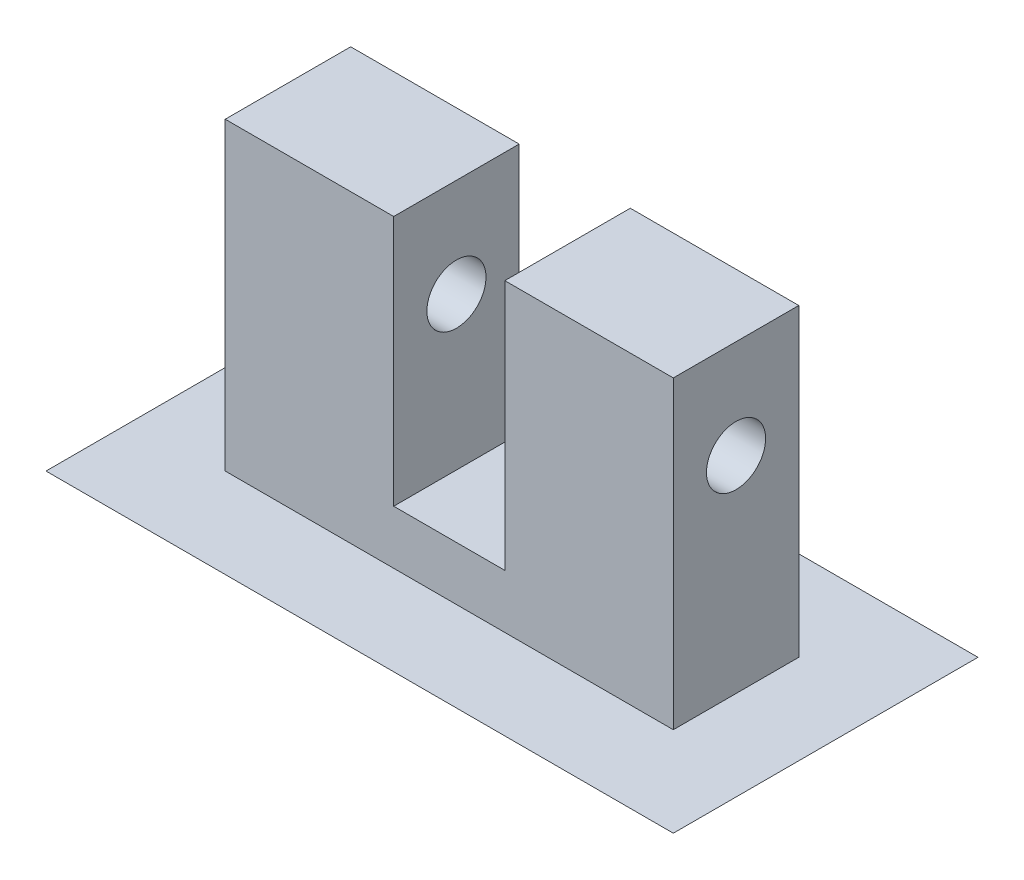
ISO-10303-21;
HEADER;
FILE_DESCRIPTION(('STEP AP214'),'2;1');
FILE_NAME('part.step','',(''),(''),'','','');
FILE_SCHEMA(('AUTOMOTIVE_DESIGN { 1 0 10303 214 1 1 1 1 }'));
ENDSEC;
DATA;
#1=APPLICATION_CONTEXT('core data for automotive mechanical design processes');
#2=APPLICATION_PROTOCOL_DEFINITION('international standard','automotive_design',2000,#1);
#3=PRODUCT_CONTEXT('',#1,'mechanical');
#4=PRODUCT('Part','Part','',(#3));
#5=PRODUCT_RELATED_PRODUCT_CATEGORY('part','',(#4));
#6=PRODUCT_DEFINITION_FORMATION('','',#4);
#7=PRODUCT_DEFINITION_CONTEXT('part definition',#1,'design');
#8=PRODUCT_DEFINITION('design','',#6,#7);
#9=PRODUCT_DEFINITION_SHAPE('','',#8);
#10=(LENGTH_UNIT() NAMED_UNIT(*) SI_UNIT(.MILLI.,.METRE.));
#11=(NAMED_UNIT(*) PLANE_ANGLE_UNIT() SI_UNIT($,.RADIAN.));
#12=(NAMED_UNIT(*) SI_UNIT($,.STERADIAN.) SOLID_ANGLE_UNIT());
#13=UNCERTAINTY_MEASURE_WITH_UNIT(LENGTH_MEASURE(1.E-05),#10,'distance_accuracy_value','');
#14=(GEOMETRIC_REPRESENTATION_CONTEXT(3) GLOBAL_UNCERTAINTY_ASSIGNED_CONTEXT((#13)) GLOBAL_UNIT_ASSIGNED_CONTEXT((#10,
#11,#12)) REPRESENTATION_CONTEXT('',''));
#15=CARTESIAN_POINT('',(0.,0.,0.));
#16=DIRECTION('',(0.,0.,1.));
#17=DIRECTION('',(1.,0.,0.));
#18=AXIS2_PLACEMENT_3D('',#15,#16,#17);
#19=CARTESIAN_POINT('',(0.,20.,0.));
#20=DIRECTION('',(0.,-1.,0.));
#21=DIRECTION('',(0.,0.,-1.));
#22=AXIS2_PLACEMENT_3D('',#19,#20,#21);
#23=PLANE('',#22);
#24=DIRECTION('',(-1.,0.,0.));
#25=VECTOR('',#24,1.);
#26=CARTESIAN_POINT('',(0.,20.,-7.));
#27=LINE('',#26,#25);
#28=CARTESIAN_POINT('',(25.,20.,-7.));
#29=VERTEX_POINT('',#28);
#30=CARTESIAN_POINT('',(15.6,20.,-7.));
#31=VERTEX_POINT('',#30);
#32=EDGE_CURVE('E198',#29,#31,#27,.T.);
#33=ORIENTED_EDGE('',*,*,#32,.T.);
#34=DIRECTION('',(0.,0.,-1.));
#35=VECTOR('',#34,1.);
#36=CARTESIAN_POINT('',(15.6,20.,15.3114336363386));
#37=LINE('',#36,#35);
#38=CARTESIAN_POINT('',(15.6,20.,0.));
#39=VERTEX_POINT('',#38);
#40=EDGE_CURVE('E148',#39,#31,#37,.T.);
#41=ORIENTED_EDGE('',*,*,#40,.F.);
#42=DIRECTION('',(1.,0.,0.));
#43=VECTOR('',#42,1.);
#44=CARTESIAN_POINT('',(0.,20.,0.));
#45=LINE('',#44,#43);
#46=CARTESIAN_POINT('',(25.,20.,0.));
#47=VERTEX_POINT('',#46);
#48=EDGE_CURVE('E191',#39,#47,#45,.T.);
#49=ORIENTED_EDGE('',*,*,#48,.T.);
#50=DIRECTION('',(0.,0.,-1.));
#51=VECTOR('',#50,1.);
#52=CARTESIAN_POINT('',(25.,20.,0.));
#53=LINE('',#52,#51);
#54=EDGE_CURVE('E195',#47,#29,#53,.T.);
#55=ORIENTED_EDGE('',*,*,#54,.T.);
#56=EDGE_LOOP('',(#33,#41,#49,#55));
#57=FACE_BOUND('',#56,.T.);
#58=ADVANCED_FACE('F38',(#57),#23,.F.);
#59=CARTESIAN_POINT('',(0.,20.,0.));
#60=DIRECTION('',(1.,0.,0.));
#61=DIRECTION('',(0.,0.,-1.));
#62=AXIS2_PLACEMENT_3D('',#59,#60,#61);
#63=PLANE('',#62);
#64=CARTESIAN_POINT('',(0.,14.5,-3.5));
#65=DIRECTION('',(-1.,0.,0.));
#66=DIRECTION('',(0.,0.,1.));
#67=AXIS2_PLACEMENT_3D('',#64,#65,#66);
#68=CIRCLE('',#67,1.65);
#69=CARTESIAN_POINT('',(0.,14.5,-1.85));
#70=VERTEX_POINT('',#69);
#71=EDGE_CURVE('E279',#70,#70,#68,.T.);
#72=ORIENTED_EDGE('',*,*,#71,.F.);
#73=EDGE_LOOP('',(#72));
#74=FACE_BOUND('',#73,.T.);
#75=DIRECTION('',(0.,0.,-1.));
#76=VECTOR('',#75,1.);
#77=CARTESIAN_POINT('',(0.,3.,0.));
#78=LINE('',#77,#76);
#79=CARTESIAN_POINT('',(0.,3.,0.));
#80=VERTEX_POINT('',#79);
#81=CARTESIAN_POINT('',(0.,3.,-7.));
#82=VERTEX_POINT('',#81);
#83=EDGE_CURVE('E185',#80,#82,#78,.T.);
#84=ORIENTED_EDGE('',*,*,#83,.F.);
#85=DIRECTION('',(0.,-1.,0.));
#86=VECTOR('',#85,1.);
#87=CARTESIAN_POINT('',(0.,20.,0.));
#88=LINE('',#87,#86);
#89=CARTESIAN_POINT('',(0.,20.,0.));
#90=VERTEX_POINT('',#89);
#91=EDGE_CURVE('E208',#90,#80,#88,.T.);
#92=ORIENTED_EDGE('',*,*,#91,.F.);
#93=DIRECTION('',(0.,0.,1.));
#94=VECTOR('',#93,1.);
#95=CARTESIAN_POINT('',(0.,20.,0.));
#96=LINE('',#95,#94);
#97=CARTESIAN_POINT('',(0.,20.,-7.));
#98=VERTEX_POINT('',#97);
#99=EDGE_CURVE('E188',#98,#90,#96,.T.);
#100=ORIENTED_EDGE('',*,*,#99,.F.);
#101=DIRECTION('',(0.,-1.,0.));
#102=VECTOR('',#101,1.);
#103=CARTESIAN_POINT('',(0.,20.,-7.));
#104=LINE('',#103,#102);
#105=EDGE_CURVE('E200',#98,#82,#104,.T.);
#106=ORIENTED_EDGE('',*,*,#105,.T.);
#107=EDGE_LOOP('',(#84,#92,#100,#106));
#108=FACE_BOUND('',#107,.T.);
#109=ADVANCED_FACE('F253',(#74,#108),#63,.F.);
#110=CARTESIAN_POINT('',(0.,20.,0.));
#111=DIRECTION('',(0.,0.,-1.));
#112=DIRECTION('',(-1.,0.,0.));
#113=AXIS2_PLACEMENT_3D('',#110,#111,#112);
#114=PLANE('',#113);
#115=ORIENTED_EDGE('',*,*,#48,.F.);
#116=DIRECTION('',(0.,1.,0.));
#117=VECTOR('',#116,1.);
#118=CARTESIAN_POINT('',(15.6,20.,0.));
#119=LINE('',#118,#117);
#120=CARTESIAN_POINT('',(15.6,6.,0.));
#121=VERTEX_POINT('',#120);
#122=EDGE_CURVE('E166',#121,#39,#119,.T.);
#123=ORIENTED_EDGE('',*,*,#122,.F.);
#124=DIRECTION('',(1.,0.,0.));
#125=VECTOR('',#124,1.);
#126=CARTESIAN_POINT('',(15.6,6.,0.));
#127=LINE('',#126,#125);
#128=CARTESIAN_POINT('',(9.4,6.,0.));
#129=VERTEX_POINT('',#128);
#130=EDGE_CURVE('E139',#129,#121,#127,.T.);
#131=ORIENTED_EDGE('',*,*,#130,.F.);
#132=DIRECTION('',(0.,-1.,0.));
#133=VECTOR('',#132,1.);
#134=CARTESIAN_POINT('',(9.4,20.,0.));
#135=LINE('',#134,#133);
#136=CARTESIAN_POINT('',(9.4,20.,0.));
#137=VERTEX_POINT('',#136);
#138=EDGE_CURVE('E161',#137,#129,#135,.T.);
#139=ORIENTED_EDGE('',*,*,#138,.F.);
#140=EDGE_CURVE('E192',#90,#137,#45,.T.);
#141=ORIENTED_EDGE('',*,*,#140,.F.);
#142=ORIENTED_EDGE('',*,*,#91,.T.);
#143=DIRECTION('',(-1.,0.,0.));
#144=VECTOR('',#143,1.);
#145=CARTESIAN_POINT('',(0.,3.,0.));
#146=LINE('',#145,#144);
#147=CARTESIAN_POINT('',(25.,3.,0.));
#148=VERTEX_POINT('',#147);
#149=EDGE_CURVE('E182',#148,#80,#146,.T.);
#150=ORIENTED_EDGE('',*,*,#149,.F.);
#151=DIRECTION('',(0.,-1.,0.));
#152=VECTOR('',#151,1.);
#153=CARTESIAN_POINT('',(25.,20.,0.));
#154=LINE('',#153,#152);
#155=EDGE_CURVE('E205',#47,#148,#154,.T.);
#156=ORIENTED_EDGE('',*,*,#155,.F.);
#157=EDGE_LOOP('',(#115,#123,#131,#139,#141,#142,#150,#156));
#158=FACE_BOUND('',#157,.T.);
#159=ADVANCED_FACE('F258',(#158),#114,.F.);
#160=CARTESIAN_POINT('',(25.,20.,0.));
#161=DIRECTION('',(-1.,0.,0.));
#162=DIRECTION('',(0.,0.,1.));
#163=AXIS2_PLACEMENT_3D('',#160,#161,#162);
#164=PLANE('',#163);
#165=CARTESIAN_POINT('',(25.,14.5,-3.5));
#166=DIRECTION('',(-1.,0.,0.));
#167=DIRECTION('',(0.,0.,1.));
#168=AXIS2_PLACEMENT_3D('',#165,#166,#167);
#169=CIRCLE('',#168,1.65);
#170=CARTESIAN_POINT('',(25.,14.5,-1.85));
#171=VERTEX_POINT('',#170);
#172=EDGE_CURVE('E276',#171,#171,#169,.F.);
#173=ORIENTED_EDGE('',*,*,#172,.F.);
#174=EDGE_LOOP('',(#173));
#175=FACE_BOUND('',#174,.T.);
#176=DIRECTION('',(0.,0.,1.));
#177=VECTOR('',#176,1.);
#178=CARTESIAN_POINT('',(25.,3.,0.));
#179=LINE('',#178,#177);
#180=CARTESIAN_POINT('',(25.,3.,-7.));
#181=VERTEX_POINT('',#180);
#182=EDGE_CURVE('E179',#181,#148,#179,.T.);
#183=ORIENTED_EDGE('',*,*,#182,.F.);
#184=DIRECTION('',(0.,-1.,0.));
#185=VECTOR('',#184,1.);
#186=CARTESIAN_POINT('',(25.,20.,-7.));
#187=LINE('',#186,#185);
#188=EDGE_CURVE('E203',#29,#181,#187,.T.);
#189=ORIENTED_EDGE('',*,*,#188,.F.);
#190=ORIENTED_EDGE('',*,*,#54,.F.);
#191=ORIENTED_EDGE('',*,*,#155,.T.);
#192=EDGE_LOOP('',(#183,#189,#190,#191));
#193=FACE_BOUND('',#192,.T.);
#194=ADVANCED_FACE('F266',(#175,#193),#164,.F.);
#195=CARTESIAN_POINT('',(0.,20.,-7.));
#196=DIRECTION('',(0.,0.,1.));
#197=DIRECTION('',(1.,0.,0.));
#198=AXIS2_PLACEMENT_3D('',#195,#196,#197);
#199=PLANE('',#198);
#200=DIRECTION('',(-1.,0.,0.));
#201=VECTOR('',#200,1.);
#202=CARTESIAN_POINT('',(15.6,6.,-7.));
#203=LINE('',#202,#201);
#204=CARTESIAN_POINT('',(15.6,6.,-7.));
#205=VERTEX_POINT('',#204);
#206=CARTESIAN_POINT('',(9.4,6.,-7.));
#207=VERTEX_POINT('',#206);
#208=EDGE_CURVE('E137',#205,#207,#203,.T.);
#209=ORIENTED_EDGE('',*,*,#208,.F.);
#210=DIRECTION('',(0.,-1.,0.));
#211=VECTOR('',#210,1.);
#212=CARTESIAN_POINT('',(15.6,20.,-7.));
#213=LINE('',#212,#211);
#214=EDGE_CURVE('E145',#31,#205,#213,.T.);
#215=ORIENTED_EDGE('',*,*,#214,.F.);
#216=ORIENTED_EDGE('',*,*,#32,.F.);
#217=ORIENTED_EDGE('',*,*,#188,.T.);
#218=DIRECTION('',(1.,0.,0.));
#219=VECTOR('',#218,1.);
#220=CARTESIAN_POINT('',(0.,3.,-7.));
#221=LINE('',#220,#219);
#222=EDGE_CURVE('E211',#82,#181,#221,.T.);
#223=ORIENTED_EDGE('',*,*,#222,.F.);
#224=ORIENTED_EDGE('',*,*,#105,.F.);
#225=CARTESIAN_POINT('',(9.4,20.,-7.));
#226=VERTEX_POINT('',#225);
#227=EDGE_CURVE('E197',#226,#98,#27,.T.);
#228=ORIENTED_EDGE('',*,*,#227,.F.);
#229=DIRECTION('',(0.,1.,0.));
#230=VECTOR('',#229,1.);
#231=CARTESIAN_POINT('',(9.4,20.,-7.));
#232=LINE('',#231,#230);
#233=EDGE_CURVE('E56',#207,#226,#232,.T.);
#234=ORIENTED_EDGE('',*,*,#233,.F.);
#235=EDGE_LOOP('',(#209,#215,#216,#217,#223,#224,#228,#234));
#236=FACE_BOUND('',#235,.T.);
#237=ADVANCED_FACE('F154',(#236),#199,.F.);
#238=ORIENTED_EDGE('',*,*,#140,.T.);
#239=DIRECTION('',(0.,0.,-1.));
#240=VECTOR('',#239,1.);
#241=CARTESIAN_POINT('',(9.4,20.,15.3114336363386));
#242=LINE('',#241,#240);
#243=EDGE_CURVE('E162',#137,#226,#242,.T.);
#244=ORIENTED_EDGE('',*,*,#243,.T.);
#245=ORIENTED_EDGE('',*,*,#227,.T.);
#246=ORIENTED_EDGE('',*,*,#99,.T.);
#247=EDGE_LOOP('',(#238,#244,#245,#246));
#248=FACE_BOUND('',#247,.T.);
#249=ADVANCED_FACE('F248',(#248),#23,.F.);
#250=CARTESIAN_POINT('',(0.,3.,0.));
#251=DIRECTION('',(0.,-1.,0.));
#252=DIRECTION('',(0.,0.,-1.));
#253=AXIS2_PLACEMENT_3D('',#250,#251,#252);
#254=PLANE('',#253);
#255=DIRECTION('',(1.,0.,0.));
#256=VECTOR('',#255,1.);
#257=CARTESIAN_POINT('',(-5.,3.,-12.));
#258=LINE('',#257,#256);
#259=CARTESIAN_POINT('',(-5.,3.,-12.));
#260=VERTEX_POINT('',#259);
#261=CARTESIAN_POINT('',(30.,3.,-12.));
#262=VERTEX_POINT('',#261);
#263=EDGE_CURVE('E167',#260,#262,#258,.T.);
#264=ORIENTED_EDGE('',*,*,#263,.F.);
#265=DIRECTION('',(0.,0.,-1.));
#266=VECTOR('',#265,1.);
#267=CARTESIAN_POINT('',(-5.,3.,-12.));
#268=LINE('',#267,#266);
#269=CARTESIAN_POINT('',(-5.,3.,5.));
#270=VERTEX_POINT('',#269);
#271=EDGE_CURVE('E176',#270,#260,#268,.T.);
#272=ORIENTED_EDGE('',*,*,#271,.F.);
#273=DIRECTION('',(-1.,0.,0.));
#274=VECTOR('',#273,1.);
#275=CARTESIAN_POINT('',(-5.,3.,5.));
#276=LINE('',#275,#274);
#277=CARTESIAN_POINT('',(30.,3.,5.));
#278=VERTEX_POINT('',#277);
#279=EDGE_CURVE('E173',#278,#270,#276,.T.);
#280=ORIENTED_EDGE('',*,*,#279,.F.);
#281=DIRECTION('',(0.,0.,1.));
#282=VECTOR('',#281,1.);
#283=CARTESIAN_POINT('',(30.,3.,-12.));
#284=LINE('',#283,#282);
#285=EDGE_CURVE('E170',#262,#278,#284,.T.);
#286=ORIENTED_EDGE('',*,*,#285,.F.);
#287=EDGE_LOOP('',(#264,#272,#280,#286));
#288=FACE_BOUND('',#287,.T.);
#289=ORIENTED_EDGE('',*,*,#149,.T.);
#290=ORIENTED_EDGE('',*,*,#83,.T.);
#291=ORIENTED_EDGE('',*,*,#222,.T.);
#292=ORIENTED_EDGE('',*,*,#182,.T.);
#293=EDGE_LOOP('',(#289,#290,#291,#292));
#294=FACE_BOUND('',#293,.T.);
#295=ADVANCED_FACE('F235',(#288,#294),#254,.F.);
#296=CARTESIAN_POINT('',(0.,0.,0.));
#297=DIRECTION('',(0.,-1.,0.));
#298=DIRECTION('',(0.,0.,-1.));
#299=AXIS2_PLACEMENT_3D('',#296,#297,#298);
#300=PLANE('',#299);
#301=DIRECTION('',(1.,0.,0.));
#302=VECTOR('',#301,1.);
#303=CARTESIAN_POINT('',(0.,0.,-6.80384757729336));
#304=LINE('',#303,#302);
#305=CARTESIAN_POINT('',(0.196152422706636,0.,-6.80384757729336));
#306=VERTEX_POINT('',#305);
#307=CARTESIAN_POINT('',(24.8038475772934,0.,-6.80384757729336));
#308=VERTEX_POINT('',#307);
#309=EDGE_CURVE('E214',#306,#308,#304,.T.);
#310=ORIENTED_EDGE('',*,*,#309,.T.);
#311=DIRECTION('',(0.,0.,1.));
#312=VECTOR('',#311,1.);
#313=CARTESIAN_POINT('',(24.8038475772934,0.,0.));
#314=LINE('',#313,#312);
#315=CARTESIAN_POINT('',(24.8038475772934,0.,-0.196152422706635));
#316=VERTEX_POINT('',#315);
#317=EDGE_CURVE('E11',#308,#316,#314,.T.);
#318=ORIENTED_EDGE('',*,*,#317,.T.);
#319=DIRECTION('',(-1.,0.,0.));
#320=VECTOR('',#319,1.);
#321=CARTESIAN_POINT('',(0.,0.,-0.196152422706636));
#322=LINE('',#321,#320);
#323=CARTESIAN_POINT('',(0.196152422706635,0.,-0.196152422706636));
#324=VERTEX_POINT('',#323);
#325=EDGE_CURVE('E48',#316,#324,#322,.T.);
#326=ORIENTED_EDGE('',*,*,#325,.T.);
#327=DIRECTION('',(0.,0.,-1.));
#328=VECTOR('',#327,1.);
#329=CARTESIAN_POINT('',(0.196152422706635,0.,0.));
#330=LINE('',#329,#328);
#331=EDGE_CURVE('E216',#324,#306,#330,.T.);
#332=ORIENTED_EDGE('',*,*,#331,.T.);
#333=EDGE_LOOP('',(#310,#318,#326,#332));
#334=FACE_BOUND('',#333,.T.);
#335=ADVANCED_FACE('F241',(#334),#300,.T.);
#336=CARTESIAN_POINT('',(0.196152422706635,0.,0.));
#337=DIRECTION('',(0.500000000000001,0.866025403784438,0.));
#338=DIRECTION('',(0.,0.,-1.));
#339=AXIS2_PLACEMENT_3D('',#336,#337,#338);
#340=PLANE('',#339);
#341=DIRECTION('',(-0.654653670707977,0.377964473009228,0.654653670707977));
#342=VECTOR('',#341,1.);
#343=CARTESIAN_POINT('',(0.112087098689506,0.048535137450803,-0.112087098689506));
#344=LINE('',#343,#342);
#345=EDGE_CURVE('E222',#270,#324,#344,.F.);
#346=ORIENTED_EDGE('',*,*,#345,.F.);
#347=ORIENTED_EDGE('',*,*,#271,.T.);
#348=DIRECTION('',(-0.654653670707977,0.377964473009228,-0.654653670707977));
#349=VECTOR('',#348,1.);
#350=CARTESIAN_POINT('',(0.112087098689506,0.0485351374508029,-6.88791290131049));
#351=LINE('',#350,#349);
#352=EDGE_CURVE('E171',#306,#260,#351,.T.);
#353=ORIENTED_EDGE('',*,*,#352,.F.);
#354=ORIENTED_EDGE('',*,*,#331,.F.);
#355=EDGE_LOOP('',(#346,#347,#353,#354));
#356=FACE_BOUND('',#355,.T.);
#357=ADVANCED_FACE('F41',(#356),#340,.F.);
#358=CARTESIAN_POINT('',(0.,0.,-6.80384757729336));
#359=DIRECTION('',(0.,0.866025403784438,0.500000000000001));
#360=DIRECTION('',(1.,0.,0.));
#361=AXIS2_PLACEMENT_3D('',#358,#359,#360);
#362=PLANE('',#361);
#363=ORIENTED_EDGE('',*,*,#352,.T.);
#364=ORIENTED_EDGE('',*,*,#263,.T.);
#365=DIRECTION('',(-0.654653670707977,-0.377964473009228,0.654653670707977));
#366=VECTOR('',#365,1.);
#367=CARTESIAN_POINT('',(14.1736271870248,-6.13736060386663,3.82637281297521));
#368=LINE('',#367,#366);
#369=EDGE_CURVE('E220',#308,#262,#368,.F.);
#370=ORIENTED_EDGE('',*,*,#369,.F.);
#371=ORIENTED_EDGE('',*,*,#309,.F.);
#372=EDGE_LOOP('',(#363,#364,#370,#371));
#373=FACE_BOUND('',#372,.T.);
#374=ADVANCED_FACE('F228',(#373),#362,.F.);
#375=CARTESIAN_POINT('',(0.,0.,-0.196152422706636));
#376=DIRECTION('',(0.,0.866025403784438,-0.500000000000001));
#377=DIRECTION('',(-1.,0.,0.));
#378=AXIS2_PLACEMENT_3D('',#375,#376,#377);
#379=PLANE('',#378);
#380=ORIENTED_EDGE('',*,*,#345,.T.);
#381=ORIENTED_EDGE('',*,*,#325,.F.);
#382=DIRECTION('',(0.654653670707977,0.377964473009228,0.654653670707977));
#383=VECTOR('',#382,1.);
#384=CARTESIAN_POINT('',(14.1736271870248,-6.13736060386663,-10.8263728129752));
#385=LINE('',#384,#383);
#386=EDGE_CURVE('E64',#278,#316,#385,.F.);
#387=ORIENTED_EDGE('',*,*,#386,.F.);
#388=ORIENTED_EDGE('',*,*,#279,.T.);
#389=EDGE_LOOP('',(#380,#381,#387,#388));
#390=FACE_BOUND('',#389,.T.);
#391=ADVANCED_FACE('F239',(#390),#379,.F.);
#392=CARTESIAN_POINT('',(24.8038475772934,0.,0.));
#393=DIRECTION('',(-0.500000000000001,0.866025403784438,0.));
#394=DIRECTION('',(0.,0.,1.));
#395=AXIS2_PLACEMENT_3D('',#392,#393,#394);
#396=PLANE('',#395);
#397=ORIENTED_EDGE('',*,*,#369,.T.);
#398=ORIENTED_EDGE('',*,*,#285,.T.);
#399=ORIENTED_EDGE('',*,*,#386,.T.);
#400=ORIENTED_EDGE('',*,*,#317,.F.);
#401=EDGE_LOOP('',(#397,#398,#399,#400));
#402=FACE_BOUND('',#401,.T.);
#403=ADVANCED_FACE('F237',(#402),#396,.F.);
#404=CARTESIAN_POINT('',(15.6,20.,15.3114336363386));
#405=DIRECTION('',(1.,0.,0.));
#406=DIRECTION('',(0.,1.,0.));
#407=AXIS2_PLACEMENT_3D('',#404,#405,#406);
#408=PLANE('',#407);
#409=CARTESIAN_POINT('',(15.6,14.5,-3.5));
#410=DIRECTION('',(1.,0.,0.));
#411=DIRECTION('',(0.,1.,0.));
#412=AXIS2_PLACEMENT_3D('',#409,#410,#411);
#413=CIRCLE('',#412,1.65);
#414=CARTESIAN_POINT('',(15.6,14.5,-1.85));
#415=VERTEX_POINT('',#414);
#416=EDGE_CURVE('E152',#415,#415,#413,.T.);
#417=ORIENTED_EDGE('',*,*,#416,.T.);
#418=EDGE_LOOP('',(#417));
#419=FACE_BOUND('',#418,.T.);
#420=ORIENTED_EDGE('',*,*,#122,.T.);
#421=ORIENTED_EDGE('',*,*,#40,.T.);
#422=ORIENTED_EDGE('',*,*,#214,.T.);
#423=DIRECTION('',(0.,0.,-1.));
#424=VECTOR('',#423,1.);
#425=CARTESIAN_POINT('',(15.6,6.,15.3114336363386));
#426=LINE('',#425,#424);
#427=EDGE_CURVE('E132',#121,#205,#426,.T.);
#428=ORIENTED_EDGE('',*,*,#427,.F.);
#429=EDGE_LOOP('',(#420,#421,#422,#428));
#430=FACE_BOUND('',#429,.T.);
#431=ADVANCED_FACE('F146',(#419,#430),#408,.F.);
#432=CARTESIAN_POINT('',(9.4,20.,15.3114336363386));
#433=DIRECTION('',(-1.,0.,0.));
#434=DIRECTION('',(0.,-1.,0.));
#435=AXIS2_PLACEMENT_3D('',#432,#433,#434);
#436=PLANE('',#435);
#437=CARTESIAN_POINT('',(9.4,14.5,-3.5));
#438=DIRECTION('',(-1.,0.,0.));
#439=DIRECTION('',(0.,-1.,0.));
#440=AXIS2_PLACEMENT_3D('',#437,#438,#439);
#441=CIRCLE('',#440,1.65);
#442=CARTESIAN_POINT('',(9.4,14.5,-1.85));
#443=VERTEX_POINT('',#442);
#444=EDGE_CURVE('E43',#443,#443,#441,.T.);
#445=ORIENTED_EDGE('',*,*,#444,.T.);
#446=EDGE_LOOP('',(#445));
#447=FACE_BOUND('',#446,.T.);
#448=ORIENTED_EDGE('',*,*,#138,.T.);
#449=DIRECTION('',(0.,0.,-1.));
#450=VECTOR('',#449,1.);
#451=CARTESIAN_POINT('',(9.4,6.,15.3114336363386));
#452=LINE('',#451,#450);
#453=EDGE_CURVE('E142',#129,#207,#452,.T.);
#454=ORIENTED_EDGE('',*,*,#453,.T.);
#455=ORIENTED_EDGE('',*,*,#233,.T.);
#456=ORIENTED_EDGE('',*,*,#243,.F.);
#457=EDGE_LOOP('',(#448,#454,#455,#456));
#458=FACE_BOUND('',#457,.T.);
#459=ADVANCED_FACE('F332',(#447,#458),#436,.F.);
#460=CARTESIAN_POINT('',(15.6,6.,15.3114336363386));
#461=DIRECTION('',(0.,-1.,0.));
#462=DIRECTION('',(0.,0.,-1.));
#463=AXIS2_PLACEMENT_3D('',#460,#461,#462);
#464=PLANE('',#463);
#465=ORIENTED_EDGE('',*,*,#130,.T.);
#466=ORIENTED_EDGE('',*,*,#427,.T.);
#467=ORIENTED_EDGE('',*,*,#208,.T.);
#468=ORIENTED_EDGE('',*,*,#453,.F.);
#469=EDGE_LOOP('',(#465,#466,#467,#468));
#470=FACE_BOUND('',#469,.T.);
#471=ADVANCED_FACE('F134',(#470),#464,.F.);
#472=CARTESIAN_POINT('',(29.6669047558312,14.5,-3.5));
#473=DIRECTION('',(-1.,0.,0.));
#474=DIRECTION('',(0.,0.,1.));
#475=AXIS2_PLACEMENT_3D('',#472,#473,#474);
#476=CYLINDRICAL_SURFACE('',#475,1.65);
#477=CARTESIAN_POINT('',(0.,14.5,-1.85));
#478=CARTESIAN_POINT('',(0.0979166666666698,14.5,-1.85));
#479=CARTESIAN_POINT('',(0.195833333333336,14.5,-1.85));
#480=CARTESIAN_POINT('',(0.39166666666667,14.5,-1.85));
#481=CARTESIAN_POINT('',(0.489583333333337,14.5,-1.85));
#482=CARTESIAN_POINT('',(0.685416666666671,14.5,-1.85));
#483=CARTESIAN_POINT('',(0.783333333333337,14.5,-1.85));
#484=CARTESIAN_POINT('',(0.97916666666667,14.5,-1.85));
#485=CARTESIAN_POINT('',(1.07708333333334,14.5,-1.85));
#486=CARTESIAN_POINT('',(1.27291666666667,14.5,-1.85));
#487=CARTESIAN_POINT('',(1.37083333333334,14.5,-1.85));
#488=CARTESIAN_POINT('',(1.56666666666667,14.5,-1.85));
#489=CARTESIAN_POINT('',(1.66458333333334,14.5,-1.85));
#490=CARTESIAN_POINT('',(1.86041666666667,14.5,-1.85));
#491=CARTESIAN_POINT('',(1.95833333333334,14.5,-1.85));
#492=CARTESIAN_POINT('',(2.15416666666667,14.5,-1.85));
#493=CARTESIAN_POINT('',(2.25208333333333,14.5,-1.85));
#494=CARTESIAN_POINT('',(2.44791666666667,14.5,-1.85));
#495=CARTESIAN_POINT('',(2.54583333333334,14.5,-1.85));
#496=CARTESIAN_POINT('',(2.74166666666667,14.5,-1.85));
#497=CARTESIAN_POINT('',(2.83958333333334,14.5,-1.85));
#498=CARTESIAN_POINT('',(3.03541666666667,14.5,-1.85));
#499=CARTESIAN_POINT('',(3.13333333333334,14.5,-1.85));
#500=CARTESIAN_POINT('',(3.32916666666667,14.5,-1.85));
#501=CARTESIAN_POINT('',(3.42708333333334,14.5,-1.85));
#502=CARTESIAN_POINT('',(3.62291666666667,14.5,-1.85));
#503=CARTESIAN_POINT('',(3.72083333333334,14.5,-1.85));
#504=CARTESIAN_POINT('',(3.91666666666667,14.5,-1.85));
#505=CARTESIAN_POINT('',(4.01458333333334,14.5,-1.85));
#506=CARTESIAN_POINT('',(4.21041666666667,14.5,-1.85));
#507=CARTESIAN_POINT('',(4.30833333333334,14.5,-1.85));
#508=CARTESIAN_POINT('',(4.50416666666667,14.5,-1.85));
#509=CARTESIAN_POINT('',(4.60208333333334,14.5,-1.85));
#510=CARTESIAN_POINT('',(4.79791666666667,14.5,-1.85));
#511=CARTESIAN_POINT('',(4.89583333333334,14.5,-1.85));
#512=CARTESIAN_POINT('',(5.09166666666667,14.5,-1.85));
#513=CARTESIAN_POINT('',(5.18958333333334,14.5,-1.85));
#514=CARTESIAN_POINT('',(5.38541666666667,14.5,-1.85));
#515=CARTESIAN_POINT('',(5.48333333333334,14.5,-1.85));
#516=CARTESIAN_POINT('',(5.67916666666667,14.5,-1.85));
#517=CARTESIAN_POINT('',(5.77708333333334,14.5,-1.85));
#518=CARTESIAN_POINT('',(5.97291666666667,14.5,-1.85));
#519=CARTESIAN_POINT('',(6.07083333333334,14.5,-1.85));
#520=CARTESIAN_POINT('',(6.26666666666667,14.5,-1.85));
#521=CARTESIAN_POINT('',(6.36458333333334,14.5,-1.85));
#522=CARTESIAN_POINT('',(6.56041666666667,14.5,-1.85));
#523=CARTESIAN_POINT('',(6.65833333333334,14.5,-1.85));
#524=CARTESIAN_POINT('',(6.85416666666667,14.5,-1.85));
#525=CARTESIAN_POINT('',(6.95208333333334,14.5,-1.85));
#526=CARTESIAN_POINT('',(7.14791666666667,14.5,-1.85));
#527=CARTESIAN_POINT('',(7.24583333333334,14.5,-1.85));
#528=CARTESIAN_POINT('',(7.44166666666667,14.5,-1.85));
#529=CARTESIAN_POINT('',(7.53958333333334,14.5,-1.85));
#530=CARTESIAN_POINT('',(7.73541666666667,14.5,-1.85));
#531=CARTESIAN_POINT('',(7.83333333333334,14.5,-1.85));
#532=CARTESIAN_POINT('',(8.02916666666667,14.5,-1.85));
#533=CARTESIAN_POINT('',(8.12708333333334,14.5,-1.85));
#534=CARTESIAN_POINT('',(8.32291666666667,14.5,-1.85));
#535=CARTESIAN_POINT('',(8.42083333333334,14.5,-1.85));
#536=CARTESIAN_POINT('',(8.61666666666667,14.5,-1.85));
#537=CARTESIAN_POINT('',(8.71458333333334,14.5,-1.85));
#538=CARTESIAN_POINT('',(8.91041666666667,14.5,-1.85));
#539=CARTESIAN_POINT('',(9.00833333333333,14.5,-1.85));
#540=CARTESIAN_POINT('',(9.20416666666667,14.5,-1.85));
#541=CARTESIAN_POINT('',(9.30208333333333,14.5,-1.85));
#542=CARTESIAN_POINT('',(9.4,14.5,-1.85));
#543=B_SPLINE_CURVE_WITH_KNOTS('',3,(#477,#478,#479,#480,#481,#482,#483,#484,#485,#486,#487,
#488,#489,#490,#491,#492,#493,#494,#495,#496,#497,#498,#499,#500,#501,#502,#503,#504,#505,#506,
#507,#508,#509,#510,#511,#512,#513,#514,#515,#516,#517,#518,#519,#520,#521,#522,#523,#524,#525,
#526,#527,#528,#529,#530,#531,#532,#533,#534,#535,#536,#537,#538,#539,#540,#541,#542),
.UNSPECIFIED.,.F.,.F.,(4,2,2,2,2,2,2,2,2,2,2,2,2,2,2,2,2,2,2,2,2,2,2,2,2,2,2,2,2,2,2,2,4),(0.,
0.293749999999999,0.587500000000001,0.88125,1.175,1.46875,1.7625,2.05625,2.35,2.64375,2.9375,
3.23125,3.525,3.81875,4.1125,4.40625,4.7,4.99375,5.2875,5.58125,5.875,6.16875,6.4625,6.75625,
7.05,7.34375,7.6375,7.93125,8.225,8.51875,8.8125,9.10625,9.4),.UNSPECIFIED.);
#544=EDGE_CURVE('BSEAM283',#70,#443,#543,.T.);
#545=ORIENTED_EDGE('',*,*,#71,.T.);
#546=ORIENTED_EDGE('',*,*,#444,.F.);
#547=ORIENTED_EDGE('',*,*,#544,.T.);
#548=ORIENTED_EDGE('',*,*,#544,.F.);
#549=EDGE_LOOP('',(#545,#547,#546,#548));
#550=FACE_BOUND('',#549,.T.);
#551=ADVANCED_FACE('F283',(#550),#476,.F.);
#552=CARTESIAN_POINT('',(25.,14.5,-1.85));
#553=CARTESIAN_POINT('',(24.9020833333333,14.5,-1.85));
#554=CARTESIAN_POINT('',(24.8041666666667,14.5,-1.85));
#555=CARTESIAN_POINT('',(24.6083333333333,14.5,-1.85));
#556=CARTESIAN_POINT('',(24.5104166666667,14.5,-1.85));
#557=CARTESIAN_POINT('',(24.3145833333333,14.5,-1.85));
#558=CARTESIAN_POINT('',(24.2166666666667,14.5,-1.85));
#559=CARTESIAN_POINT('',(24.0208333333333,14.5,-1.85));
#560=CARTESIAN_POINT('',(23.9229166666667,14.5,-1.85));
#561=CARTESIAN_POINT('',(23.7270833333333,14.5,-1.85));
#562=CARTESIAN_POINT('',(23.6291666666667,14.5,-1.85));
#563=CARTESIAN_POINT('',(23.4333333333333,14.5,-1.85));
#564=CARTESIAN_POINT('',(23.3354166666667,14.5,-1.85));
#565=CARTESIAN_POINT('',(23.1395833333333,14.5,-1.85));
#566=CARTESIAN_POINT('',(23.0416666666667,14.5,-1.85));
#567=CARTESIAN_POINT('',(22.8458333333333,14.5,-1.85));
#568=CARTESIAN_POINT('',(22.7479166666667,14.5,-1.85));
#569=CARTESIAN_POINT('',(22.5520833333333,14.5,-1.85));
#570=CARTESIAN_POINT('',(22.4541666666667,14.5,-1.85));
#571=CARTESIAN_POINT('',(22.2583333333333,14.5,-1.85));
#572=CARTESIAN_POINT('',(22.1604166666667,14.5,-1.85));
#573=CARTESIAN_POINT('',(21.9645833333333,14.5,-1.85));
#574=CARTESIAN_POINT('',(21.8666666666667,14.5,-1.85));
#575=CARTESIAN_POINT('',(21.6708333333333,14.5,-1.85));
#576=CARTESIAN_POINT('',(21.5729166666667,14.5,-1.85));
#577=CARTESIAN_POINT('',(21.3770833333333,14.5,-1.85));
#578=CARTESIAN_POINT('',(21.2791666666667,14.5,-1.85));
#579=CARTESIAN_POINT('',(21.0833333333333,14.5,-1.85));
#580=CARTESIAN_POINT('',(20.9854166666667,14.5,-1.85));
#581=CARTESIAN_POINT('',(20.7895833333333,14.5,-1.85));
#582=CARTESIAN_POINT('',(20.6916666666667,14.5,-1.85));
#583=CARTESIAN_POINT('',(20.4958333333333,14.5,-1.85));
#584=CARTESIAN_POINT('',(20.3979166666667,14.5,-1.85));
#585=CARTESIAN_POINT('',(20.2020833333333,14.5,-1.85));
#586=CARTESIAN_POINT('',(20.1041666666667,14.5,-1.85));
#587=CARTESIAN_POINT('',(19.9083333333333,14.5,-1.85));
#588=CARTESIAN_POINT('',(19.8104166666667,14.5,-1.85));
#589=CARTESIAN_POINT('',(19.6145833333333,14.5,-1.85));
#590=CARTESIAN_POINT('',(19.5166666666667,14.5,-1.85));
#591=CARTESIAN_POINT('',(19.3208333333333,14.5,-1.85));
#592=CARTESIAN_POINT('',(19.2229166666667,14.5,-1.85));
#593=CARTESIAN_POINT('',(19.0270833333333,14.5,-1.85));
#594=CARTESIAN_POINT('',(18.9291666666667,14.5,-1.85));
#595=CARTESIAN_POINT('',(18.7333333333333,14.5,-1.85));
#596=CARTESIAN_POINT('',(18.6354166666667,14.5,-1.85));
#597=CARTESIAN_POINT('',(18.4395833333333,14.5,-1.85));
#598=CARTESIAN_POINT('',(18.3416666666667,14.5,-1.85));
#599=CARTESIAN_POINT('',(18.1458333333333,14.5,-1.85));
#600=CARTESIAN_POINT('',(18.0479166666667,14.5,-1.85));
#601=CARTESIAN_POINT('',(17.8520833333333,14.5,-1.85));
#602=CARTESIAN_POINT('',(17.7541666666667,14.5,-1.85));
#603=CARTESIAN_POINT('',(17.5583333333333,14.5,-1.85));
#604=CARTESIAN_POINT('',(17.4604166666667,14.5,-1.85));
#605=CARTESIAN_POINT('',(17.2645833333333,14.5,-1.85));
#606=CARTESIAN_POINT('',(17.1666666666667,14.5,-1.85));
#607=CARTESIAN_POINT('',(16.9708333333333,14.5,-1.85));
#608=CARTESIAN_POINT('',(16.8729166666667,14.5,-1.85));
#609=CARTESIAN_POINT('',(16.6770833333333,14.5,-1.85));
#610=CARTESIAN_POINT('',(16.5791666666667,14.5,-1.85));
#611=CARTESIAN_POINT('',(16.3833333333333,14.5,-1.85));
#612=CARTESIAN_POINT('',(16.2854166666667,14.5,-1.85));
#613=CARTESIAN_POINT('',(16.0895833333333,14.5,-1.85));
#614=CARTESIAN_POINT('',(15.9916666666667,14.5,-1.85));
#615=CARTESIAN_POINT('',(15.7958333333333,14.5,-1.85));
#616=CARTESIAN_POINT('',(15.6979166666667,14.5,-1.85));
#617=CARTESIAN_POINT('',(15.6,14.5,-1.85));
#618=B_SPLINE_CURVE_WITH_KNOTS('',3,(#552,#553,#554,#555,#556,#557,#558,#559,#560,#561,#562,
#563,#564,#565,#566,#567,#568,#569,#570,#571,#572,#573,#574,#575,#576,#577,#578,#579,#580,#581,
#582,#583,#584,#585,#586,#587,#588,#589,#590,#591,#592,#593,#594,#595,#596,#597,#598,#599,#600,
#601,#602,#603,#604,#605,#606,#607,#608,#609,#610,#611,#612,#613,#614,#615,#616,#617),
.UNSPECIFIED.,.F.,.F.,(4,2,2,2,2,2,2,2,2,2,2,2,2,2,2,2,2,2,2,2,2,2,2,2,2,2,2,2,2,2,2,2,4),(0.,
0.293749999999999,0.587500000000001,0.88125,1.175,1.46875,1.7625,2.05625,2.35,2.64375,2.9375,
3.23125,3.525,3.81875,4.1125,4.40625,4.7,4.99375,5.2875,5.58125,5.875,6.16875,6.4625,6.75625,
7.05,7.34375,7.6375,7.93125,8.225,8.51875,8.8125,9.10625,9.4),.UNSPECIFIED.);
#619=EDGE_CURVE('BSEAM354',#171,#415,#618,.T.);
#620=ORIENTED_EDGE('',*,*,#172,.T.);
#621=ORIENTED_EDGE('',*,*,#416,.F.);
#622=ORIENTED_EDGE('',*,*,#619,.T.);
#623=ORIENTED_EDGE('',*,*,#619,.F.);
#624=EDGE_LOOP('',(#620,#622,#621,#623));
#625=FACE_BOUND('',#624,.T.);
#626=ADVANCED_FACE('F354',(#625),#476,.F.);
#627=CLOSED_SHELL('',(#58,#109,#159,#194,#237,#249,#295,#335,#357,#374,#391,#403,#431,#459,#471,
#551,#626));
#628=MANIFOLD_SOLID_BREP('B2',#627);
#629=ADVANCED_BREP_SHAPE_REPRESENTATION('',(#18,#628),#14);
#630=SHAPE_DEFINITION_REPRESENTATION(#9,#629);
ENDSEC;
END-ISO-10303-21;
